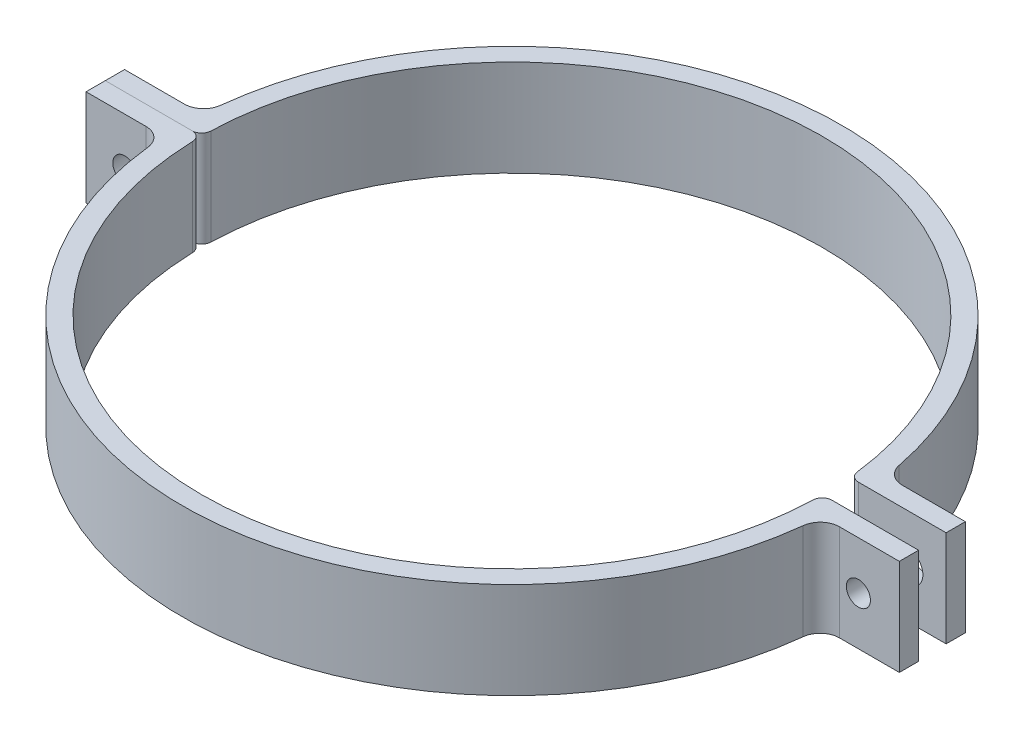
ISO-10303-21;
HEADER;
FILE_DESCRIPTION(('STEP AP214'),'2;1');
FILE_NAME('part.step','',(''),(''),'','','');
FILE_SCHEMA(('AUTOMOTIVE_DESIGN { 1 0 10303 214 1 1 1 1 }'));
ENDSEC;
DATA;
#1=APPLICATION_CONTEXT('core data for automotive mechanical design processes');
#2=APPLICATION_PROTOCOL_DEFINITION('international standard','automotive_design',2000,#1);
#3=PRODUCT_CONTEXT('',#1,'mechanical');
#4=PRODUCT('Part','Part','',(#3));
#5=PRODUCT_RELATED_PRODUCT_CATEGORY('part','',(#4));
#6=PRODUCT_DEFINITION_FORMATION('','',#4);
#7=PRODUCT_DEFINITION_CONTEXT('part definition',#1,'design');
#8=PRODUCT_DEFINITION('design','',#6,#7);
#9=PRODUCT_DEFINITION_SHAPE('','',#8);
#10=(LENGTH_UNIT() NAMED_UNIT(*) SI_UNIT(.MILLI.,.METRE.));
#11=(NAMED_UNIT(*) PLANE_ANGLE_UNIT() SI_UNIT($,.RADIAN.));
#12=(NAMED_UNIT(*) SI_UNIT($,.STERADIAN.) SOLID_ANGLE_UNIT());
#13=UNCERTAINTY_MEASURE_WITH_UNIT(LENGTH_MEASURE(1.E-05),#10,'distance_accuracy_value','');
#14=(GEOMETRIC_REPRESENTATION_CONTEXT(3) GLOBAL_UNCERTAINTY_ASSIGNED_CONTEXT((#13)) GLOBAL_UNIT_ASSIGNED_CONTEXT((#10,
#11,#12)) REPRESENTATION_CONTEXT('',''));
#15=CARTESIAN_POINT('',(0.,0.,0.));
#16=DIRECTION('',(0.,0.,1.));
#17=DIRECTION('',(1.,0.,0.));
#18=AXIS2_PLACEMENT_3D('',#15,#16,#17);
#19=CARTESIAN_POINT('',(0.,10.,0.));
#20=DIRECTION('',(0.,-1.,0.));
#21=DIRECTION('',(0.,0.,-1.));
#22=AXIS2_PLACEMENT_3D('',#19,#20,#21);
#23=CYLINDRICAL_SURFACE('',#22,34.25);
#24=CARTESIAN_POINT('',(0.,0.,0.));
#25=DIRECTION('',(0.,1.,0.));
#26=DIRECTION('',(0.,0.,1.));
#27=AXIS2_PLACEMENT_3D('',#24,#25,#26);
#28=CIRCLE('',#27,34.25);
#29=CARTESIAN_POINT('',(33.6053602983926,0.,-6.61379310344828));
#30=VERTEX_POINT('',#29);
#31=CARTESIAN_POINT('',(-34.0408477173745,0.,-3.77931034482759));
#32=VERTEX_POINT('',#31);
#33=EDGE_CURVE('E201',#30,#32,#28,.T.);
#34=ORIENTED_EDGE('',*,*,#33,.T.);
#35=DIRECTION('',(0.,-1.,0.));
#36=VECTOR('',#35,1.);
#37=CARTESIAN_POINT('',(-34.0408477173745,10.,-3.77931034482759));
#38=LINE('',#37,#36);
#39=CARTESIAN_POINT('',(-34.0408477173745,10.,-3.77931034482759));
#40=VERTEX_POINT('',#39);
#41=EDGE_CURVE('E222',#32,#40,#38,.F.);
#42=ORIENTED_EDGE('',*,*,#41,.T.);
#43=CARTESIAN_POINT('',(0.,10.,0.));
#44=DIRECTION('',(0.,1.,0.));
#45=DIRECTION('',(0.,0.,1.));
#46=AXIS2_PLACEMENT_3D('',#43,#44,#45);
#47=CIRCLE('',#46,34.25);
#48=CARTESIAN_POINT('',(33.6053602983926,10.,-6.61379310344828));
#49=VERTEX_POINT('',#48);
#50=EDGE_CURVE('E198',#49,#40,#47,.T.);
#51=ORIENTED_EDGE('',*,*,#50,.F.);
#52=DIRECTION('',(0.,-1.,0.));
#53=VECTOR('',#52,1.);
#54=CARTESIAN_POINT('',(33.6053602983926,10.,-6.61379310344828));
#55=LINE('',#54,#53);
#56=EDGE_CURVE('E219',#49,#30,#55,.T.);
#57=ORIENTED_EDGE('',*,*,#56,.T.);
#58=EDGE_LOOP('',(#34,#42,#51,#57));
#59=FACE_BOUND('',#58,.T.);
#60=ADVANCED_FACE('F50',(#59),#23,.T.);
#61=CARTESIAN_POINT('',(0.,0.,0.));
#62=DIRECTION('',(0.,0.,1.));
#63=DIRECTION('',(1.,0.,0.));
#64=AXIS2_PLACEMENT_3D('',#61,#62,#63);
#65=PLANE('',#64);
#66=CARTESIAN_POINT('',(-38.2207779875617,5.,0.));
#67=DIRECTION('',(0.,0.,1.));
#68=DIRECTION('',(1.,0.,0.));
#69=AXIS2_PLACEMENT_3D('',#66,#67,#68);
#70=CIRCLE('',#69,1.69999999999999);
#71=CARTESIAN_POINT('',(-36.5207779875617,5.,0.));
#72=VERTEX_POINT('',#71);
#73=EDGE_CURVE('E211',#72,#72,#70,.T.);
#74=ORIENTED_EDGE('',*,*,#73,.F.);
#75=EDGE_LOOP('',(#74));
#76=FACE_BOUND('',#75,.T.);
#77=DIRECTION('',(1.,0.,0.));
#78=VECTOR('',#77,1.);
#79=CARTESIAN_POINT('',(0.,0.,0.));
#80=LINE('',#79,#78);
#81=CARTESIAN_POINT('',(-42.25,0.,0.));
#82=VERTEX_POINT('',#81);
#83=CARTESIAN_POINT('',(-33.2349590040367,0.,0.));
#84=VERTEX_POINT('',#83);
#85=EDGE_CURVE('E194',#82,#84,#80,.T.);
#86=ORIENTED_EDGE('',*,*,#85,.T.);
#87=DIRECTION('',(0.,-1.,0.));
#88=VECTOR('',#87,1.);
#89=CARTESIAN_POINT('',(-33.2349590040367,0.,0.));
#90=LINE('',#89,#88);
#91=CARTESIAN_POINT('',(-33.2349590040367,10.,0.));
#92=VERTEX_POINT('',#91);
#93=EDGE_CURVE('E73',#84,#92,#90,.F.);
#94=ORIENTED_EDGE('',*,*,#93,.T.);
#95=DIRECTION('',(1.,0.,0.));
#96=VECTOR('',#95,1.);
#97=CARTESIAN_POINT('',(0.,10.,0.));
#98=LINE('',#97,#96);
#99=CARTESIAN_POINT('',(-42.25,10.,0.));
#100=VERTEX_POINT('',#99);
#101=EDGE_CURVE('E196',#100,#92,#98,.T.);
#102=ORIENTED_EDGE('',*,*,#101,.F.);
#103=DIRECTION('',(0.,-1.,0.));
#104=VECTOR('',#103,1.);
#105=CARTESIAN_POINT('',(-42.25,0.,0.));
#106=LINE('',#105,#104);
#107=EDGE_CURVE('E153',#100,#82,#106,.T.);
#108=ORIENTED_EDGE('',*,*,#107,.T.);
#109=EDGE_LOOP('',(#86,#94,#102,#108));
#110=FACE_BOUND('',#109,.T.);
#111=ADVANCED_FACE('F253',(#76,#110),#65,.T.);
#112=CARTESIAN_POINT('',(0.,0.,0.));
#113=DIRECTION('',(0.,1.,0.));
#114=DIRECTION('',(0.,0.,1.));
#115=AXIS2_PLACEMENT_3D('',#112,#113,#114);
#116=PLANE('',#115);
#117=CARTESIAN_POINT('',(0.,0.,0.));
#118=DIRECTION('',(0.,1.,0.));
#119=DIRECTION('',(0.,0.,1.));
#120=AXIS2_PLACEMENT_3D('',#117,#118,#119);
#121=CIRCLE('',#120,32.25);
#122=CARTESIAN_POINT('',(32.0157841344568,0.,-3.8796992481203));
#123=VERTEX_POINT('',#122);
#124=CARTESIAN_POINT('',(-32.2354113648176,0.,-0.969924812030075));
#125=VERTEX_POINT('',#124);
#126=EDGE_CURVE('E207',#123,#125,#121,.T.);
#127=ORIENTED_EDGE('',*,*,#126,.T.);
#128=CARTESIAN_POINT('',(-33.2349590040367,0.,-1.));
#129=DIRECTION('',(0.,1.,0.));
#130=DIRECTION('',(0.,0.,1.));
#131=AXIS2_PLACEMENT_3D('',#128,#129,#130);
#132=CIRCLE('',#131,1.);
#133=EDGE_CURVE('E240',#125,#84,#132,.F.);
#134=ORIENTED_EDGE('',*,*,#133,.T.);
#135=ORIENTED_EDGE('',*,*,#85,.F.);
#136=DIRECTION('',(0.,0.,1.));
#137=VECTOR('',#136,1.);
#138=CARTESIAN_POINT('',(-42.25,0.,-2.));
#139=LINE('',#138,#137);
#140=CARTESIAN_POINT('',(-42.25,0.,-2.));
#141=VERTEX_POINT('',#140);
#142=EDGE_CURVE('E161',#141,#82,#139,.T.);
#143=ORIENTED_EDGE('',*,*,#142,.F.);
#144=DIRECTION('',(1.,0.,0.));
#145=VECTOR('',#144,1.);
#146=CARTESIAN_POINT('',(-32.25,0.,-2.));
#147=LINE('',#146,#145);
#148=CARTESIAN_POINT('',(-36.0286344453963,0.,-2.));
#149=VERTEX_POINT('',#148);
#150=EDGE_CURVE('E162',#141,#149,#147,.T.);
#151=ORIENTED_EDGE('',*,*,#150,.T.);
#152=CARTESIAN_POINT('',(-36.0286344453963,0.,-4.));
#153=DIRECTION('',(0.,1.,0.));
#154=DIRECTION('',(0.,0.,1.));
#155=AXIS2_PLACEMENT_3D('',#152,#153,#154);
#156=CIRCLE('',#155,2.);
#157=EDGE_CURVE('E226',#149,#32,#156,.T.);
#158=ORIENTED_EDGE('',*,*,#157,.T.);
#159=ORIENTED_EDGE('',*,*,#33,.F.);
#160=CARTESIAN_POINT('',(35.5677171041381,0.,-7.));
#161=DIRECTION('',(0.,1.,0.));
#162=DIRECTION('',(0.,0.,1.));
#163=AXIS2_PLACEMENT_3D('',#160,#161,#162);
#164=CIRCLE('',#163,2.);
#165=CARTESIAN_POINT('',(35.5677171041381,0.,-5.));
#166=VERTEX_POINT('',#165);
#167=EDGE_CURVE('E229',#30,#166,#164,.T.);
#168=ORIENTED_EDGE('',*,*,#167,.T.);
#169=DIRECTION('',(1.,0.,0.));
#170=VECTOR('',#169,1.);
#171=CARTESIAN_POINT('',(32.1101619429115,0.,-5.));
#172=LINE('',#171,#170);
#173=CARTESIAN_POINT('',(42.1101619429115,0.,-5.));
#174=VERTEX_POINT('',#173);
#175=EDGE_CURVE('E174',#166,#174,#172,.T.);
#176=ORIENTED_EDGE('',*,*,#175,.T.);
#177=DIRECTION('',(0.,0.,1.));
#178=VECTOR('',#177,1.);
#179=CARTESIAN_POINT('',(42.1101619429115,0.,-5.));
#180=LINE('',#179,#178);
#181=CARTESIAN_POINT('',(42.1101619429115,0.,-3.));
#182=VERTEX_POINT('',#181);
#183=EDGE_CURVE('E182',#174,#182,#180,.T.);
#184=ORIENTED_EDGE('',*,*,#183,.T.);
#185=DIRECTION('',(-1.,0.,0.));
#186=VECTOR('',#185,1.);
#187=CARTESIAN_POINT('',(27.7467052715466,0.,-3.));
#188=LINE('',#187,#186);
#189=CARTESIAN_POINT('',(33.0085216269981,0.,-3.));
#190=VERTEX_POINT('',#189);
#191=EDGE_CURVE('E191',#182,#190,#188,.T.);
#192=ORIENTED_EDGE('',*,*,#191,.T.);
#193=CARTESIAN_POINT('',(33.0085216269981,0.,-4.));
#194=DIRECTION('',(0.,1.,0.));
#195=DIRECTION('',(0.,0.,1.));
#196=AXIS2_PLACEMENT_3D('',#193,#194,#195);
#197=CIRCLE('',#196,1.);
#198=EDGE_CURVE('E238',#190,#123,#197,.F.);
#199=ORIENTED_EDGE('',*,*,#198,.T.);
#200=EDGE_LOOP('',(#127,#134,#135,#143,#151,#158,#159,#168,#176,#184,#192,#199));
#201=FACE_BOUND('',#200,.T.);
#202=ADVANCED_FACE('F252',(#201),#116,.F.);
#203=CARTESIAN_POINT('',(0.,10.,0.));
#204=DIRECTION('',(0.,1.,0.));
#205=DIRECTION('',(0.,0.,1.));
#206=AXIS2_PLACEMENT_3D('',#203,#204,#205);
#207=PLANE('',#206);
#208=ORIENTED_EDGE('',*,*,#101,.T.);
#209=CARTESIAN_POINT('',(-33.2349590040367,10.,-1.));
#210=DIRECTION('',(0.,1.,0.));
#211=DIRECTION('',(0.,0.,1.));
#212=AXIS2_PLACEMENT_3D('',#209,#210,#211);
#213=CIRCLE('',#212,1.);
#214=CARTESIAN_POINT('',(-32.2354113648176,10.,-0.969924812030075));
#215=VERTEX_POINT('',#214);
#216=EDGE_CURVE('E58',#92,#215,#213,.T.);
#217=ORIENTED_EDGE('',*,*,#216,.T.);
#218=CARTESIAN_POINT('',(0.,10.,0.));
#219=DIRECTION('',(0.,1.,0.));
#220=DIRECTION('',(0.,0.,1.));
#221=AXIS2_PLACEMENT_3D('',#218,#219,#220);
#222=CIRCLE('',#221,32.25);
#223=CARTESIAN_POINT('',(32.0157841344568,10.,-3.8796992481203));
#224=VERTEX_POINT('',#223);
#225=EDGE_CURVE('E204',#224,#215,#222,.T.);
#226=ORIENTED_EDGE('',*,*,#225,.F.);
#227=CARTESIAN_POINT('',(33.0085216269981,10.,-4.));
#228=DIRECTION('',(0.,1.,0.));
#229=DIRECTION('',(0.,0.,1.));
#230=AXIS2_PLACEMENT_3D('',#227,#228,#229);
#231=CIRCLE('',#230,1.);
#232=CARTESIAN_POINT('',(33.0085216269981,10.,-3.));
#233=VERTEX_POINT('',#232);
#234=EDGE_CURVE('E65',#224,#233,#231,.T.);
#235=ORIENTED_EDGE('',*,*,#234,.T.);
#236=DIRECTION('',(-1.,0.,0.));
#237=VECTOR('',#236,1.);
#238=CARTESIAN_POINT('',(27.7467052715466,10.,-3.));
#239=LINE('',#238,#237);
#240=CARTESIAN_POINT('',(42.1101619429115,10.,-3.));
#241=VERTEX_POINT('',#240);
#242=EDGE_CURVE('E188',#241,#233,#239,.T.);
#243=ORIENTED_EDGE('',*,*,#242,.F.);
#244=DIRECTION('',(0.,0.,1.));
#245=VECTOR('',#244,1.);
#246=CARTESIAN_POINT('',(42.1101619429115,10.,-5.));
#247=LINE('',#246,#245);
#248=CARTESIAN_POINT('',(42.1101619429115,10.,-5.));
#249=VERTEX_POINT('',#248);
#250=EDGE_CURVE('E185',#249,#241,#247,.T.);
#251=ORIENTED_EDGE('',*,*,#250,.F.);
#252=DIRECTION('',(-1.,0.,0.));
#253=VECTOR('',#252,1.);
#254=CARTESIAN_POINT('',(32.1101619429115,10.,-5.));
#255=LINE('',#254,#253);
#256=CARTESIAN_POINT('',(35.5677171041381,10.,-5.));
#257=VERTEX_POINT('',#256);
#258=EDGE_CURVE('E179',#249,#257,#255,.T.);
#259=ORIENTED_EDGE('',*,*,#258,.T.);
#260=CARTESIAN_POINT('',(35.5677171041381,10.,-7.));
#261=DIRECTION('',(0.,1.,0.));
#262=DIRECTION('',(0.,0.,1.));
#263=AXIS2_PLACEMENT_3D('',#260,#261,#262);
#264=CIRCLE('',#263,2.);
#265=EDGE_CURVE('E231',#257,#49,#264,.F.);
#266=ORIENTED_EDGE('',*,*,#265,.T.);
#267=ORIENTED_EDGE('',*,*,#50,.T.);
#268=CARTESIAN_POINT('',(-36.0286344453963,10.,-4.));
#269=DIRECTION('',(0.,1.,0.));
#270=DIRECTION('',(0.,0.,1.));
#271=AXIS2_PLACEMENT_3D('',#268,#269,#270);
#272=CIRCLE('',#271,2.);
#273=CARTESIAN_POINT('',(-36.0286344453963,10.,-2.));
#274=VERTEX_POINT('',#273);
#275=EDGE_CURVE('E147',#40,#274,#272,.F.);
#276=ORIENTED_EDGE('',*,*,#275,.T.);
#277=DIRECTION('',(-1.,0.,0.));
#278=VECTOR('',#277,1.);
#279=CARTESIAN_POINT('',(-32.25,10.,-2.));
#280=LINE('',#279,#278);
#281=CARTESIAN_POINT('',(-42.25,10.,-2.));
#282=VERTEX_POINT('',#281);
#283=EDGE_CURVE('E140',#274,#282,#280,.T.);
#284=ORIENTED_EDGE('',*,*,#283,.T.);
#285=DIRECTION('',(0.,0.,1.));
#286=VECTOR('',#285,1.);
#287=CARTESIAN_POINT('',(-42.25,10.,-2.));
#288=LINE('',#287,#286);
#289=EDGE_CURVE('E143',#282,#100,#288,.T.);
#290=ORIENTED_EDGE('',*,*,#289,.T.);
#291=EDGE_LOOP('',(#208,#217,#226,#235,#243,#251,#259,#266,#267,#276,#284,#290));
#292=FACE_BOUND('',#291,.T.);
#293=ADVANCED_FACE('F142',(#292),#207,.T.);
#294=CARTESIAN_POINT('',(0.,10.,0.));
#295=DIRECTION('',(0.,-1.,0.));
#296=DIRECTION('',(0.,0.,-1.));
#297=AXIS2_PLACEMENT_3D('',#294,#295,#296);
#298=CYLINDRICAL_SURFACE('',#297,32.25);
#299=ORIENTED_EDGE('',*,*,#225,.T.);
#300=DIRECTION('',(0.,-1.,0.));
#301=VECTOR('',#300,1.);
#302=CARTESIAN_POINT('',(-32.2354113648176,10.,-0.969924812030075));
#303=LINE('',#302,#301);
#304=EDGE_CURVE('E235',#215,#125,#303,.T.);
#305=ORIENTED_EDGE('',*,*,#304,.T.);
#306=ORIENTED_EDGE('',*,*,#126,.F.);
#307=DIRECTION('',(0.,-1.,0.));
#308=VECTOR('',#307,1.);
#309=CARTESIAN_POINT('',(32.0157841344568,10.,-3.8796992481203));
#310=LINE('',#309,#308);
#311=EDGE_CURVE('E233',#123,#224,#310,.F.);
#312=ORIENTED_EDGE('',*,*,#311,.T.);
#313=EDGE_LOOP('',(#299,#305,#306,#312));
#314=FACE_BOUND('',#313,.T.);
#315=ADVANCED_FACE('F247',(#314),#298,.F.);
#316=CARTESIAN_POINT('',(27.7467052715466,0.,-3.));
#317=DIRECTION('',(0.,0.,-1.));
#318=DIRECTION('',(-1.,0.,0.));
#319=AXIS2_PLACEMENT_3D('',#316,#317,#318);
#320=PLANE('',#319);
#321=CARTESIAN_POINT('',(37.9966164685705,5.,-3.));
#322=DIRECTION('',(0.,0.,-1.));
#323=DIRECTION('',(-1.,0.,0.));
#324=AXIS2_PLACEMENT_3D('',#321,#322,#323);
#325=CIRCLE('',#324,1.69999999999999);
#326=CARTESIAN_POINT('',(36.2966164685705,5.,-3.));
#327=VERTEX_POINT('',#326);
#328=EDGE_CURVE('E214',#327,#327,#325,.T.);
#329=ORIENTED_EDGE('',*,*,#328,.T.);
#330=EDGE_LOOP('',(#329));
#331=FACE_BOUND('',#330,.T.);
#332=ORIENTED_EDGE('',*,*,#242,.T.);
#333=DIRECTION('',(0.,1.,0.));
#334=VECTOR('',#333,1.);
#335=CARTESIAN_POINT('',(33.0085216269981,0.,-3.));
#336=LINE('',#335,#334);
#337=EDGE_CURVE('E13',#233,#190,#336,.F.);
#338=ORIENTED_EDGE('',*,*,#337,.T.);
#339=ORIENTED_EDGE('',*,*,#191,.F.);
#340=DIRECTION('',(0.,1.,0.));
#341=VECTOR('',#340,1.);
#342=CARTESIAN_POINT('',(42.1101619429115,0.,-3.));
#343=LINE('',#342,#341);
#344=EDGE_CURVE('E172',#182,#241,#343,.T.);
#345=ORIENTED_EDGE('',*,*,#344,.T.);
#346=EDGE_LOOP('',(#332,#338,#339,#345));
#347=FACE_BOUND('',#346,.T.);
#348=ADVANCED_FACE('F257',(#331,#347),#320,.F.);
#349=CARTESIAN_POINT('',(0.,0.,-5.));
#350=DIRECTION('',(0.,0.,-1.));
#351=DIRECTION('',(-1.,0.,0.));
#352=AXIS2_PLACEMENT_3D('',#349,#350,#351);
#353=PLANE('',#352);
#354=CARTESIAN_POINT('',(37.9966164685705,5.,-5.));
#355=DIRECTION('',(0.,0.,-1.));
#356=DIRECTION('',(-1.,0.,0.));
#357=AXIS2_PLACEMENT_3D('',#354,#355,#356);
#358=CIRCLE('',#357,1.69999999999999);
#359=CARTESIAN_POINT('',(36.2966164685705,5.,-5.));
#360=VERTEX_POINT('',#359);
#361=EDGE_CURVE('E217',#360,#360,#358,.T.);
#362=ORIENTED_EDGE('',*,*,#361,.F.);
#363=EDGE_LOOP('',(#362));
#364=FACE_BOUND('',#363,.T.);
#365=ORIENTED_EDGE('',*,*,#175,.F.);
#366=DIRECTION('',(0.,-1.,0.));
#367=VECTOR('',#366,1.);
#368=CARTESIAN_POINT('',(35.5677171041381,0.,-5.));
#369=LINE('',#368,#367);
#370=EDGE_CURVE('E224',#166,#257,#369,.F.);
#371=ORIENTED_EDGE('',*,*,#370,.T.);
#372=ORIENTED_EDGE('',*,*,#258,.F.);
#373=DIRECTION('',(0.,1.,0.));
#374=VECTOR('',#373,1.);
#375=CARTESIAN_POINT('',(42.1101619429115,0.,-5.));
#376=LINE('',#375,#374);
#377=EDGE_CURVE('E176',#174,#249,#376,.T.);
#378=ORIENTED_EDGE('',*,*,#377,.F.);
#379=EDGE_LOOP('',(#365,#371,#372,#378));
#380=FACE_BOUND('',#379,.T.);
#381=ADVANCED_FACE('F269',(#364,#380),#353,.T.);
#382=CARTESIAN_POINT('',(42.1101619429115,0.,-5.));
#383=DIRECTION('',(1.,0.,0.));
#384=DIRECTION('',(0.,0.,-1.));
#385=AXIS2_PLACEMENT_3D('',#382,#383,#384);
#386=PLANE('',#385);
#387=ORIENTED_EDGE('',*,*,#344,.F.);
#388=ORIENTED_EDGE('',*,*,#183,.F.);
#389=ORIENTED_EDGE('',*,*,#377,.T.);
#390=ORIENTED_EDGE('',*,*,#250,.T.);
#391=EDGE_LOOP('',(#387,#388,#389,#390));
#392=FACE_BOUND('',#391,.T.);
#393=ADVANCED_FACE('F299',(#392),#386,.T.);
#394=CARTESIAN_POINT('',(0.,0.,-2.));
#395=DIRECTION('',(0.,0.,1.));
#396=DIRECTION('',(1.,0.,0.));
#397=AXIS2_PLACEMENT_3D('',#394,#395,#396);
#398=PLANE('',#397);
#399=CARTESIAN_POINT('',(-38.2207779875617,5.,-2.));
#400=DIRECTION('',(0.,0.,1.));
#401=DIRECTION('',(1.,0.,0.));
#402=AXIS2_PLACEMENT_3D('',#399,#400,#401);
#403=CIRCLE('',#402,1.69999999999999);
#404=CARTESIAN_POINT('',(-36.5207779875617,5.,-2.));
#405=VERTEX_POINT('',#404);
#406=EDGE_CURVE('E171',#405,#405,#403,.T.);
#407=ORIENTED_EDGE('',*,*,#406,.T.);
#408=EDGE_LOOP('',(#407));
#409=FACE_BOUND('',#408,.T.);
#410=ORIENTED_EDGE('',*,*,#283,.F.);
#411=DIRECTION('',(0.,1.,0.));
#412=VECTOR('',#411,1.);
#413=CARTESIAN_POINT('',(-36.0286344453963,0.,-2.));
#414=LINE('',#413,#412);
#415=EDGE_CURVE('E210',#274,#149,#414,.F.);
#416=ORIENTED_EDGE('',*,*,#415,.T.);
#417=ORIENTED_EDGE('',*,*,#150,.F.);
#418=DIRECTION('',(0.,-1.,0.));
#419=VECTOR('',#418,1.);
#420=CARTESIAN_POINT('',(-42.25,0.,-2.));
#421=LINE('',#420,#419);
#422=EDGE_CURVE('E152',#282,#141,#421,.T.);
#423=ORIENTED_EDGE('',*,*,#422,.F.);
#424=EDGE_LOOP('',(#410,#416,#417,#423));
#425=FACE_BOUND('',#424,.T.);
#426=ADVANCED_FACE('F164',(#409,#425),#398,.F.);
#427=CARTESIAN_POINT('',(-42.25,0.,-2.));
#428=DIRECTION('',(-1.,0.,0.));
#429=DIRECTION('',(0.,0.,1.));
#430=AXIS2_PLACEMENT_3D('',#427,#428,#429);
#431=PLANE('',#430);
#432=ORIENTED_EDGE('',*,*,#107,.F.);
#433=ORIENTED_EDGE('',*,*,#289,.F.);
#434=ORIENTED_EDGE('',*,*,#422,.T.);
#435=ORIENTED_EDGE('',*,*,#142,.T.);
#436=EDGE_LOOP('',(#432,#433,#434,#435));
#437=FACE_BOUND('',#436,.T.);
#438=ADVANCED_FACE('F157',(#437),#431,.T.);
#439=CARTESIAN_POINT('',(-38.2207779875617,5.,-5.));
#440=DIRECTION('',(0.,0.,-1.));
#441=DIRECTION('',(-1.,0.,0.));
#442=AXIS2_PLACEMENT_3D('',#439,#440,#441);
#443=CYLINDRICAL_SURFACE('',#442,1.69999999999999);
#444=ORIENTED_EDGE('',*,*,#73,.T.);
#445=EDGE_LOOP('',(#444));
#446=FACE_BOUND('',#445,.T.);
#447=ORIENTED_EDGE('',*,*,#406,.F.);
#448=EDGE_LOOP('',(#447));
#449=FACE_BOUND('',#448,.T.);
#450=ADVANCED_FACE('F319',(#446,#449),#443,.F.);
#451=CARTESIAN_POINT('',(37.9966164685705,5.,-5.));
#452=DIRECTION('',(0.,0.,-1.));
#453=DIRECTION('',(-1.,0.,0.));
#454=AXIS2_PLACEMENT_3D('',#451,#452,#453);
#455=CYLINDRICAL_SURFACE('',#454,1.69999999999999);
#456=ORIENTED_EDGE('',*,*,#361,.T.);
#457=EDGE_LOOP('',(#456));
#458=FACE_BOUND('',#457,.T.);
#459=ORIENTED_EDGE('',*,*,#328,.F.);
#460=EDGE_LOOP('',(#459));
#461=FACE_BOUND('',#460,.T.);
#462=ADVANCED_FACE('F281',(#458,#461),#455,.F.);
#463=CARTESIAN_POINT('',(-36.0286344453963,10.,-4.));
#464=DIRECTION('',(0.,-1.,0.));
#465=DIRECTION('',(0.,0.,-1.));
#466=AXIS2_PLACEMENT_3D('',#463,#464,#465);
#467=CYLINDRICAL_SURFACE('',#466,2.);
#468=ORIENTED_EDGE('',*,*,#275,.F.);
#469=ORIENTED_EDGE('',*,*,#41,.F.);
#470=ORIENTED_EDGE('',*,*,#157,.F.);
#471=ORIENTED_EDGE('',*,*,#415,.F.);
#472=EDGE_LOOP('',(#468,#469,#470,#471));
#473=FACE_BOUND('',#472,.T.);
#474=ADVANCED_FACE('F277',(#473),#467,.F.);
#475=CARTESIAN_POINT('',(35.5677171041381,10.,-7.));
#476=DIRECTION('',(0.,-1.,0.));
#477=DIRECTION('',(0.,0.,-1.));
#478=AXIS2_PLACEMENT_3D('',#475,#476,#477);
#479=CYLINDRICAL_SURFACE('',#478,2.);
#480=ORIENTED_EDGE('',*,*,#265,.F.);
#481=ORIENTED_EDGE('',*,*,#370,.F.);
#482=ORIENTED_EDGE('',*,*,#167,.F.);
#483=ORIENTED_EDGE('',*,*,#56,.F.);
#484=EDGE_LOOP('',(#480,#481,#482,#483));
#485=FACE_BOUND('',#484,.T.);
#486=ADVANCED_FACE('F280',(#485),#479,.F.);
#487=CARTESIAN_POINT('',(-33.2349590040367,10.,-1.));
#488=DIRECTION('',(0.,-1.,0.));
#489=DIRECTION('',(0.,0.,-1.));
#490=AXIS2_PLACEMENT_3D('',#487,#488,#489);
#491=CYLINDRICAL_SURFACE('',#490,1.);
#492=ORIENTED_EDGE('',*,*,#216,.F.);
#493=ORIENTED_EDGE('',*,*,#93,.F.);
#494=ORIENTED_EDGE('',*,*,#133,.F.);
#495=ORIENTED_EDGE('',*,*,#304,.F.);
#496=EDGE_LOOP('',(#492,#493,#494,#495));
#497=FACE_BOUND('',#496,.T.);
#498=ADVANCED_FACE('F250',(#497),#491,.T.);
#499=CARTESIAN_POINT('',(33.0085216269981,10.,-4.));
#500=DIRECTION('',(0.,-1.,0.));
#501=DIRECTION('',(0.,0.,-1.));
#502=AXIS2_PLACEMENT_3D('',#499,#500,#501);
#503=CYLINDRICAL_SURFACE('',#502,1.);
#504=ORIENTED_EDGE('',*,*,#234,.F.);
#505=ORIENTED_EDGE('',*,*,#311,.F.);
#506=ORIENTED_EDGE('',*,*,#198,.F.);
#507=ORIENTED_EDGE('',*,*,#337,.F.);
#508=EDGE_LOOP('',(#504,#505,#506,#507));
#509=FACE_BOUND('',#508,.T.);
#510=ADVANCED_FACE('F52',(#509),#503,.T.);
#511=CLOSED_SHELL('',(#60,#111,#202,#293,#315,#348,#381,#393,#426,#438,#450,#462,#474,#486,#498,#510));
#512=MANIFOLD_SOLID_BREP('B2',#511);
#513=CARTESIAN_POINT('',(0.,10.,0.));
#514=DIRECTION('',(0.,-1.,0.));
#515=DIRECTION('',(0.,0.,-1.));
#516=AXIS2_PLACEMENT_3D('',#513,#514,#515);
#517=CYLINDRICAL_SURFACE('',#516,34.25);
#518=CARTESIAN_POINT('',(0.,10.,0.));
#519=DIRECTION('',(0.,1.,0.));
#520=DIRECTION('',(0.,0.,1.));
#521=AXIS2_PLACEMENT_3D('',#518,#519,#520);
#522=CIRCLE('',#521,34.25);
#523=CARTESIAN_POINT('',(-34.0408477173745,10.,3.77931034482759));
#524=VERTEX_POINT('',#523);
#525=CARTESIAN_POINT('',(34.0408477173745,10.,3.77931034482759));
#526=VERTEX_POINT('',#525);
#527=EDGE_CURVE('E581',#524,#526,#522,.T.);
#528=ORIENTED_EDGE('',*,*,#527,.F.);
#529=DIRECTION('',(0.,-1.,0.));
#530=VECTOR('',#529,1.);
#531=CARTESIAN_POINT('',(-34.0408477173745,10.,3.77931034482759));
#532=LINE('',#531,#530);
#533=CARTESIAN_POINT('',(-34.0408477173745,0.,3.77931034482759));
#534=VERTEX_POINT('',#533);
#535=EDGE_CURVE('E619',#524,#534,#532,.T.);
#536=ORIENTED_EDGE('',*,*,#535,.T.);
#537=CARTESIAN_POINT('',(0.,0.,0.));
#538=DIRECTION('',(0.,1.,0.));
#539=DIRECTION('',(0.,0.,1.));
#540=AXIS2_PLACEMENT_3D('',#537,#538,#539);
#541=CIRCLE('',#540,34.25);
#542=CARTESIAN_POINT('',(34.0408477173745,0.,3.77931034482759));
#543=VERTEX_POINT('',#542);
#544=EDGE_CURVE('E578',#534,#543,#541,.T.);
#545=ORIENTED_EDGE('',*,*,#544,.T.);
#546=DIRECTION('',(0.,-1.,0.));
#547=VECTOR('',#546,1.);
#548=CARTESIAN_POINT('',(34.0408477173745,10.,3.77931034482759));
#549=LINE('',#548,#547);
#550=EDGE_CURVE('E617',#543,#526,#549,.F.);
#551=ORIENTED_EDGE('',*,*,#550,.T.);
#552=EDGE_LOOP('',(#528,#536,#545,#551));
#553=FACE_BOUND('',#552,.T.);
#554=ADVANCED_FACE('F442',(#553),#517,.T.);
#555=CARTESIAN_POINT('',(0.,0.,0.));
#556=DIRECTION('',(0.,0.,1.));
#557=DIRECTION('',(1.,0.,0.));
#558=AXIS2_PLACEMENT_3D('',#555,#556,#557);
#559=PLANE('',#558);
#560=CARTESIAN_POINT('',(-38.2207779875617,5.,0.));
#561=DIRECTION('',(0.,0.,1.));
#562=DIRECTION('',(1.,0.,0.));
#563=AXIS2_PLACEMENT_3D('',#560,#561,#562);
#564=CIRCLE('',#563,1.25);
#565=CARTESIAN_POINT('',(-36.9707779875617,5.,0.));
#566=VERTEX_POINT('',#565);
#567=EDGE_CURVE('E555',#566,#566,#564,.T.);
#568=ORIENTED_EDGE('',*,*,#567,.T.);
#569=EDGE_LOOP('',(#568));
#570=FACE_BOUND('',#569,.T.);
#571=DIRECTION('',(1.,0.,0.));
#572=VECTOR('',#571,1.);
#573=CARTESIAN_POINT('',(0.,10.,0.));
#574=LINE('',#573,#572);
#575=CARTESIAN_POINT('',(-42.25,10.,0.));
#576=VERTEX_POINT('',#575);
#577=CARTESIAN_POINT('',(-33.2349590040367,10.,0.));
#578=VERTEX_POINT('',#577);
#579=EDGE_CURVE('E589',#576,#578,#574,.T.);
#580=ORIENTED_EDGE('',*,*,#579,.T.);
#581=DIRECTION('',(0.,1.,0.));
#582=VECTOR('',#581,1.);
#583=CARTESIAN_POINT('',(-33.2349590040367,0.,0.));
#584=LINE('',#583,#582);
#585=CARTESIAN_POINT('',(-33.2349590040367,0.,0.));
#586=VERTEX_POINT('',#585);
#587=EDGE_CURVE('E614',#578,#586,#584,.F.);
#588=ORIENTED_EDGE('',*,*,#587,.T.);
#589=DIRECTION('',(1.,0.,0.));
#590=VECTOR('',#589,1.);
#591=CARTESIAN_POINT('',(0.,0.,0.));
#592=LINE('',#591,#590);
#593=CARTESIAN_POINT('',(-42.25,0.,0.));
#594=VERTEX_POINT('',#593);
#595=EDGE_CURVE('E586',#594,#586,#592,.T.);
#596=ORIENTED_EDGE('',*,*,#595,.F.);
#597=DIRECTION('',(0.,1.,0.));
#598=VECTOR('',#597,1.);
#599=CARTESIAN_POINT('',(-42.25,0.,0.));
#600=LINE('',#599,#598);
#601=EDGE_CURVE('E556',#594,#576,#600,.T.);
#602=ORIENTED_EDGE('',*,*,#601,.T.);
#603=EDGE_LOOP('',(#580,#588,#596,#602));
#604=FACE_BOUND('',#603,.T.);
#605=ADVANCED_FACE('F643',(#570,#604),#559,.F.);
#606=CARTESIAN_POINT('',(37.9966164685705,5.,0.));
#607=DIRECTION('',(0.,0.,1.));
#608=DIRECTION('',(1.,0.,0.));
#609=AXIS2_PLACEMENT_3D('',#606,#607,#608);
#610=CIRCLE('',#609,1.25);
#611=CARTESIAN_POINT('',(39.2466164685705,5.,0.));
#612=VERTEX_POINT('',#611);
#613=EDGE_CURVE('E596',#612,#612,#610,.T.);
#614=ORIENTED_EDGE('',*,*,#613,.T.);
#615=EDGE_LOOP('',(#614));
#616=FACE_BOUND('',#615,.T.);
#617=CARTESIAN_POINT('',(33.2349590040367,0.,0.));
#618=VERTEX_POINT('',#617);
#619=CARTESIAN_POINT('',(42.25,0.,0.));
#620=VERTEX_POINT('',#619);
#621=EDGE_CURVE('E583',#618,#620,#592,.T.);
#622=ORIENTED_EDGE('',*,*,#621,.F.);
#623=DIRECTION('',(0.,1.,0.));
#624=VECTOR('',#623,1.);
#625=CARTESIAN_POINT('',(33.2349590040367,10.,0.));
#626=LINE('',#625,#624);
#627=CARTESIAN_POINT('',(33.2349590040367,10.,0.));
#628=VERTEX_POINT('',#627);
#629=EDGE_CURVE('E592',#618,#628,#626,.T.);
#630=ORIENTED_EDGE('',*,*,#629,.T.);
#631=CARTESIAN_POINT('',(42.25,10.,0.));
#632=VERTEX_POINT('',#631);
#633=EDGE_CURVE('E590',#628,#632,#574,.T.);
#634=ORIENTED_EDGE('',*,*,#633,.T.);
#635=DIRECTION('',(0.,-1.,0.));
#636=VECTOR('',#635,1.);
#637=CARTESIAN_POINT('',(42.25,0.,0.));
#638=LINE('',#637,#636);
#639=EDGE_CURVE('E537',#632,#620,#638,.T.);
#640=ORIENTED_EDGE('',*,*,#639,.T.);
#641=EDGE_LOOP('',(#622,#630,#634,#640));
#642=FACE_BOUND('',#641,.T.);
#643=ADVANCED_FACE('F648',(#616,#642),#559,.F.);
#644=CARTESIAN_POINT('',(0.,10.,0.));
#645=DIRECTION('',(0.,1.,0.));
#646=DIRECTION('',(0.,0.,1.));
#647=AXIS2_PLACEMENT_3D('',#644,#645,#646);
#648=PLANE('',#647);
#649=ORIENTED_EDGE('',*,*,#633,.F.);
#650=CARTESIAN_POINT('',(33.2349590040367,10.,1.));
#651=DIRECTION('',(0.,1.,0.));
#652=DIRECTION('',(0.,0.,1.));
#653=AXIS2_PLACEMENT_3D('',#650,#651,#652);
#654=CIRCLE('',#653,1.);
#655=CARTESIAN_POINT('',(32.2354113648176,10.,0.969924812030075));
#656=VERTEX_POINT('',#655);
#657=EDGE_CURVE('E604',#628,#656,#654,.T.);
#658=ORIENTED_EDGE('',*,*,#657,.T.);
#659=CARTESIAN_POINT('',(0.,10.,0.));
#660=DIRECTION('',(0.,1.,0.));
#661=DIRECTION('',(0.,0.,1.));
#662=AXIS2_PLACEMENT_3D('',#659,#660,#661);
#663=CIRCLE('',#662,32.25);
#664=CARTESIAN_POINT('',(-32.2354113648176,10.,0.969924812030075));
#665=VERTEX_POINT('',#664);
#666=EDGE_CURVE('E575',#665,#656,#663,.T.);
#667=ORIENTED_EDGE('',*,*,#666,.F.);
#668=CARTESIAN_POINT('',(-33.2349590040367,10.,1.));
#669=DIRECTION('',(0.,1.,0.));
#670=DIRECTION('',(0.,0.,1.));
#671=AXIS2_PLACEMENT_3D('',#668,#669,#670);
#672=CIRCLE('',#671,1.);
#673=EDGE_CURVE('E602',#665,#578,#672,.T.);
#674=ORIENTED_EDGE('',*,*,#673,.T.);
#675=ORIENTED_EDGE('',*,*,#579,.F.);
#676=DIRECTION('',(0.,0.,-1.));
#677=VECTOR('',#676,1.);
#678=CARTESIAN_POINT('',(-42.25,10.,2.));
#679=LINE('',#678,#677);
#680=CARTESIAN_POINT('',(-42.25,10.,2.));
#681=VERTEX_POINT('',#680);
#682=EDGE_CURVE('E569',#681,#576,#679,.T.);
#683=ORIENTED_EDGE('',*,*,#682,.F.);
#684=DIRECTION('',(1.,0.,0.));
#685=VECTOR('',#684,1.);
#686=CARTESIAN_POINT('',(-32.25,10.,2.));
#687=LINE('',#686,#685);
#688=CARTESIAN_POINT('',(-36.0286344453963,10.,2.));
#689=VERTEX_POINT('',#688);
#690=EDGE_CURVE('E563',#681,#689,#687,.T.);
#691=ORIENTED_EDGE('',*,*,#690,.T.);
#692=CARTESIAN_POINT('',(-36.0286344453963,10.,4.));
#693=DIRECTION('',(0.,1.,0.));
#694=DIRECTION('',(0.,0.,1.));
#695=AXIS2_PLACEMENT_3D('',#692,#693,#694);
#696=CIRCLE('',#695,2.);
#697=EDGE_CURVE('E628',#689,#524,#696,.F.);
#698=ORIENTED_EDGE('',*,*,#697,.T.);
#699=ORIENTED_EDGE('',*,*,#527,.T.);
#700=CARTESIAN_POINT('',(36.0286344453963,10.,4.));
#701=DIRECTION('',(0.,1.,0.));
#702=DIRECTION('',(0.,0.,1.));
#703=AXIS2_PLACEMENT_3D('',#700,#701,#702);
#704=CIRCLE('',#703,2.);
#705=CARTESIAN_POINT('',(36.0286344453963,10.,2.));
#706=VERTEX_POINT('',#705);
#707=EDGE_CURVE('E48',#526,#706,#704,.F.);
#708=ORIENTED_EDGE('',*,*,#707,.T.);
#709=DIRECTION('',(1.,0.,0.));
#710=VECTOR('',#709,1.);
#711=CARTESIAN_POINT('',(32.25,10.,2.));
#712=LINE('',#711,#710);
#713=CARTESIAN_POINT('',(42.25,10.,2.));
#714=VERTEX_POINT('',#713);
#715=EDGE_CURVE('E528',#706,#714,#712,.T.);
#716=ORIENTED_EDGE('',*,*,#715,.T.);
#717=DIRECTION('',(0.,0.,-1.));
#718=VECTOR('',#717,1.);
#719=CARTESIAN_POINT('',(42.25,10.,2.));
#720=LINE('',#719,#718);
#721=EDGE_CURVE('E532',#714,#632,#720,.T.);
#722=ORIENTED_EDGE('',*,*,#721,.T.);
#723=EDGE_LOOP('',(#649,#658,#667,#674,#675,#683,#691,#698,#699,#708,#716,#722));
#724=FACE_BOUND('',#723,.T.);
#725=ADVANCED_FACE('F531',(#724),#648,.T.);
#726=CARTESIAN_POINT('',(0.,0.,0.));
#727=DIRECTION('',(0.,1.,0.));
#728=DIRECTION('',(0.,0.,1.));
#729=AXIS2_PLACEMENT_3D('',#726,#727,#728);
#730=PLANE('',#729);
#731=CARTESIAN_POINT('',(0.,0.,0.));
#732=DIRECTION('',(0.,1.,0.));
#733=DIRECTION('',(0.,0.,1.));
#734=AXIS2_PLACEMENT_3D('',#731,#732,#733);
#735=CIRCLE('',#734,32.25);
#736=CARTESIAN_POINT('',(-32.2354113648176,0.,0.969924812030075));
#737=VERTEX_POINT('',#736);
#738=CARTESIAN_POINT('',(32.2354113648176,0.,0.969924812030075));
#739=VERTEX_POINT('',#738);
#740=EDGE_CURVE('E572',#737,#739,#735,.T.);
#741=ORIENTED_EDGE('',*,*,#740,.T.);
#742=CARTESIAN_POINT('',(33.2349590040367,0.,1.));
#743=DIRECTION('',(0.,1.,0.));
#744=DIRECTION('',(0.,0.,1.));
#745=AXIS2_PLACEMENT_3D('',#742,#743,#744);
#746=CIRCLE('',#745,1.);
#747=EDGE_CURVE('E612',#739,#618,#746,.F.);
#748=ORIENTED_EDGE('',*,*,#747,.T.);
#749=ORIENTED_EDGE('',*,*,#621,.T.);
#750=DIRECTION('',(0.,0.,-1.));
#751=VECTOR('',#750,1.);
#752=CARTESIAN_POINT('',(42.25,0.,2.));
#753=LINE('',#752,#751);
#754=CARTESIAN_POINT('',(42.25,0.,2.));
#755=VERTEX_POINT('',#754);
#756=EDGE_CURVE('E545',#755,#620,#753,.T.);
#757=ORIENTED_EDGE('',*,*,#756,.F.);
#758=DIRECTION('',(-1.,0.,0.));
#759=VECTOR('',#758,1.);
#760=CARTESIAN_POINT('',(32.25,0.,2.));
#761=LINE('',#760,#759);
#762=CARTESIAN_POINT('',(36.0286344453963,0.,2.));
#763=VERTEX_POINT('',#762);
#764=EDGE_CURVE('E546',#755,#763,#761,.T.);
#765=ORIENTED_EDGE('',*,*,#764,.T.);
#766=CARTESIAN_POINT('',(36.0286344453963,0.,4.));
#767=DIRECTION('',(0.,1.,0.));
#768=DIRECTION('',(0.,0.,1.));
#769=AXIS2_PLACEMENT_3D('',#766,#767,#768);
#770=CIRCLE('',#769,2.);
#771=EDGE_CURVE('E450',#763,#543,#770,.T.);
#772=ORIENTED_EDGE('',*,*,#771,.T.);
#773=ORIENTED_EDGE('',*,*,#544,.F.);
#774=CARTESIAN_POINT('',(-36.0286344453963,0.,4.));
#775=DIRECTION('',(0.,1.,0.));
#776=DIRECTION('',(0.,0.,1.));
#777=AXIS2_PLACEMENT_3D('',#774,#775,#776);
#778=CIRCLE('',#777,2.);
#779=CARTESIAN_POINT('',(-36.0286344453963,0.,2.));
#780=VERTEX_POINT('',#779);
#781=EDGE_CURVE('E626',#534,#780,#778,.T.);
#782=ORIENTED_EDGE('',*,*,#781,.T.);
#783=DIRECTION('',(-1.,0.,0.));
#784=VECTOR('',#783,1.);
#785=CARTESIAN_POINT('',(-32.25,0.,2.));
#786=LINE('',#785,#784);
#787=CARTESIAN_POINT('',(-42.25,0.,2.));
#788=VERTEX_POINT('',#787);
#789=EDGE_CURVE('E558',#780,#788,#786,.T.);
#790=ORIENTED_EDGE('',*,*,#789,.T.);
#791=DIRECTION('',(0.,0.,-1.));
#792=VECTOR('',#791,1.);
#793=CARTESIAN_POINT('',(-42.25,0.,2.));
#794=LINE('',#793,#792);
#795=EDGE_CURVE('E566',#788,#594,#794,.T.);
#796=ORIENTED_EDGE('',*,*,#795,.T.);
#797=ORIENTED_EDGE('',*,*,#595,.T.);
#798=CARTESIAN_POINT('',(-33.2349590040367,0.,1.));
#799=DIRECTION('',(0.,1.,0.));
#800=DIRECTION('',(0.,0.,1.));
#801=AXIS2_PLACEMENT_3D('',#798,#799,#800);
#802=CIRCLE('',#801,1.);
#803=EDGE_CURVE('E610',#586,#737,#802,.F.);
#804=ORIENTED_EDGE('',*,*,#803,.T.);
#805=EDGE_LOOP('',(#741,#748,#749,#757,#765,#772,#773,#782,#790,#796,#797,#804));
#806=FACE_BOUND('',#805,.T.);
#807=ADVANCED_FACE('F631',(#806),#730,.F.);
#808=CARTESIAN_POINT('',(0.,10.,0.));
#809=DIRECTION('',(0.,-1.,0.));
#810=DIRECTION('',(0.,0.,-1.));
#811=AXIS2_PLACEMENT_3D('',#808,#809,#810);
#812=CYLINDRICAL_SURFACE('',#811,32.25);
#813=ORIENTED_EDGE('',*,*,#666,.T.);
#814=DIRECTION('',(0.,-1.,0.));
#815=VECTOR('',#814,1.);
#816=CARTESIAN_POINT('',(32.2354113648176,10.,0.969924812030075));
#817=LINE('',#816,#815);
#818=EDGE_CURVE('E608',#656,#739,#817,.T.);
#819=ORIENTED_EDGE('',*,*,#818,.T.);
#820=ORIENTED_EDGE('',*,*,#740,.F.);
#821=DIRECTION('',(0.,-1.,0.));
#822=VECTOR('',#821,1.);
#823=CARTESIAN_POINT('',(-32.2354113648176,10.,0.969924812030075));
#824=LINE('',#823,#822);
#825=EDGE_CURVE('E606',#737,#665,#824,.F.);
#826=ORIENTED_EDGE('',*,*,#825,.T.);
#827=EDGE_LOOP('',(#813,#819,#820,#826));
#828=FACE_BOUND('',#827,.T.);
#829=ADVANCED_FACE('F681',(#828),#812,.F.);
#830=CARTESIAN_POINT('',(0.,0.,2.));
#831=DIRECTION('',(0.,0.,1.));
#832=DIRECTION('',(1.,0.,0.));
#833=AXIS2_PLACEMENT_3D('',#830,#831,#832);
#834=PLANE('',#833);
#835=CARTESIAN_POINT('',(-38.2207779875617,5.,2.));
#836=DIRECTION('',(0.,0.,1.));
#837=DIRECTION('',(1.,0.,0.));
#838=AXIS2_PLACEMENT_3D('',#835,#836,#837);
#839=CIRCLE('',#838,1.25);
#840=CARTESIAN_POINT('',(-36.9707779875617,5.,2.));
#841=VERTEX_POINT('',#840);
#842=EDGE_CURVE('E595',#841,#841,#839,.T.);
#843=ORIENTED_EDGE('',*,*,#842,.F.);
#844=EDGE_LOOP('',(#843));
#845=FACE_BOUND('',#844,.T.);
#846=ORIENTED_EDGE('',*,*,#789,.F.);
#847=DIRECTION('',(0.,-1.,0.));
#848=VECTOR('',#847,1.);
#849=CARTESIAN_POINT('',(-36.0286344453963,0.,2.));
#850=LINE('',#849,#848);
#851=EDGE_CURVE('E622',#780,#689,#850,.F.);
#852=ORIENTED_EDGE('',*,*,#851,.T.);
#853=ORIENTED_EDGE('',*,*,#690,.F.);
#854=DIRECTION('',(0.,1.,0.));
#855=VECTOR('',#854,1.);
#856=CARTESIAN_POINT('',(-42.25,0.,2.));
#857=LINE('',#856,#855);
#858=EDGE_CURVE('E560',#788,#681,#857,.T.);
#859=ORIENTED_EDGE('',*,*,#858,.F.);
#860=EDGE_LOOP('',(#846,#852,#853,#859));
#861=FACE_BOUND('',#860,.T.);
#862=ADVANCED_FACE('F679',(#845,#861),#834,.T.);
#863=CARTESIAN_POINT('',(-42.25,0.,2.));
#864=DIRECTION('',(-1.,0.,0.));
#865=DIRECTION('',(0.,0.,1.));
#866=AXIS2_PLACEMENT_3D('',#863,#864,#865);
#867=PLANE('',#866);
#868=ORIENTED_EDGE('',*,*,#601,.F.);
#869=ORIENTED_EDGE('',*,*,#795,.F.);
#870=ORIENTED_EDGE('',*,*,#858,.T.);
#871=ORIENTED_EDGE('',*,*,#682,.T.);
#872=EDGE_LOOP('',(#868,#869,#870,#871));
#873=FACE_BOUND('',#872,.T.);
#874=ADVANCED_FACE('F672',(#873),#867,.T.);
#875=CARTESIAN_POINT('',(0.,0.,2.));
#876=DIRECTION('',(0.,0.,-1.));
#877=DIRECTION('',(-1.,0.,0.));
#878=AXIS2_PLACEMENT_3D('',#875,#876,#877);
#879=PLANE('',#878);
#880=CARTESIAN_POINT('',(37.9966164685705,5.,2.));
#881=DIRECTION('',(0.,0.,1.));
#882=DIRECTION('',(1.,0.,0.));
#883=AXIS2_PLACEMENT_3D('',#880,#881,#882);
#884=CIRCLE('',#883,1.25);
#885=CARTESIAN_POINT('',(39.2466164685705,5.,2.));
#886=VERTEX_POINT('',#885);
#887=EDGE_CURVE('E599',#886,#886,#884,.T.);
#888=ORIENTED_EDGE('',*,*,#887,.F.);
#889=EDGE_LOOP('',(#888));
#890=FACE_BOUND('',#889,.T.);
#891=ORIENTED_EDGE('',*,*,#715,.F.);
#892=DIRECTION('',(0.,1.,0.));
#893=VECTOR('',#892,1.);
#894=CARTESIAN_POINT('',(36.0286344453963,0.,2.));
#895=LINE('',#894,#893);
#896=EDGE_CURVE('E624',#706,#763,#895,.F.);
#897=ORIENTED_EDGE('',*,*,#896,.T.);
#898=ORIENTED_EDGE('',*,*,#764,.F.);
#899=DIRECTION('',(0.,-1.,0.));
#900=VECTOR('',#899,1.);
#901=CARTESIAN_POINT('',(42.25,0.,2.));
#902=LINE('',#901,#900);
#903=EDGE_CURVE('E536',#714,#755,#902,.T.);
#904=ORIENTED_EDGE('',*,*,#903,.F.);
#905=EDGE_LOOP('',(#891,#897,#898,#904));
#906=FACE_BOUND('',#905,.T.);
#907=ADVANCED_FACE('F548',(#890,#906),#879,.F.);
#908=CARTESIAN_POINT('',(42.25,0.,2.));
#909=DIRECTION('',(1.,0.,0.));
#910=DIRECTION('',(0.,0.,-1.));
#911=AXIS2_PLACEMENT_3D('',#908,#909,#910);
#912=PLANE('',#911);
#913=ORIENTED_EDGE('',*,*,#639,.F.);
#914=ORIENTED_EDGE('',*,*,#721,.F.);
#915=ORIENTED_EDGE('',*,*,#903,.T.);
#916=ORIENTED_EDGE('',*,*,#756,.T.);
#917=EDGE_LOOP('',(#913,#914,#915,#916));
#918=FACE_BOUND('',#917,.T.);
#919=ADVANCED_FACE('F541',(#918),#912,.T.);
#920=CARTESIAN_POINT('',(-38.2207779875617,5.,2.));
#921=DIRECTION('',(0.,0.,1.));
#922=DIRECTION('',(1.,0.,0.));
#923=AXIS2_PLACEMENT_3D('',#920,#921,#922);
#924=CYLINDRICAL_SURFACE('',#923,1.25);
#925=ORIENTED_EDGE('',*,*,#842,.T.);
#926=EDGE_LOOP('',(#925));
#927=FACE_BOUND('',#926,.T.);
#928=ORIENTED_EDGE('',*,*,#567,.F.);
#929=EDGE_LOOP('',(#928));
#930=FACE_BOUND('',#929,.T.);
#931=ADVANCED_FACE('F710',(#927,#930),#924,.F.);
#932=CARTESIAN_POINT('',(37.9966164685705,5.,2.));
#933=DIRECTION('',(0.,0.,1.));
#934=DIRECTION('',(1.,0.,0.));
#935=AXIS2_PLACEMENT_3D('',#932,#933,#934);
#936=CYLINDRICAL_SURFACE('',#935,1.25);
#937=ORIENTED_EDGE('',*,*,#887,.T.);
#938=EDGE_LOOP('',(#937));
#939=FACE_BOUND('',#938,.T.);
#940=ORIENTED_EDGE('',*,*,#613,.F.);
#941=EDGE_LOOP('',(#940));
#942=FACE_BOUND('',#941,.T.);
#943=ADVANCED_FACE('F657',(#939,#942),#936,.F.);
#944=CARTESIAN_POINT('',(33.2349590040367,10.,1.));
#945=DIRECTION('',(0.,-1.,0.));
#946=DIRECTION('',(0.,0.,-1.));
#947=AXIS2_PLACEMENT_3D('',#944,#945,#946);
#948=CYLINDRICAL_SURFACE('',#947,1.);
#949=ORIENTED_EDGE('',*,*,#747,.F.);
#950=ORIENTED_EDGE('',*,*,#818,.F.);
#951=ORIENTED_EDGE('',*,*,#657,.F.);
#952=ORIENTED_EDGE('',*,*,#629,.F.);
#953=EDGE_LOOP('',(#949,#950,#951,#952));
#954=FACE_BOUND('',#953,.T.);
#955=ADVANCED_FACE('F654',(#954),#948,.T.);
#956=CARTESIAN_POINT('',(-33.2349590040367,10.,1.));
#957=DIRECTION('',(0.,-1.,0.));
#958=DIRECTION('',(0.,0.,-1.));
#959=AXIS2_PLACEMENT_3D('',#956,#957,#958);
#960=CYLINDRICAL_SURFACE('',#959,1.);
#961=ORIENTED_EDGE('',*,*,#673,.F.);
#962=ORIENTED_EDGE('',*,*,#825,.F.);
#963=ORIENTED_EDGE('',*,*,#803,.F.);
#964=ORIENTED_EDGE('',*,*,#587,.F.);
#965=EDGE_LOOP('',(#961,#962,#963,#964));
#966=FACE_BOUND('',#965,.T.);
#967=ADVANCED_FACE('F640',(#966),#960,.T.);
#968=CARTESIAN_POINT('',(-36.0286344453963,10.,4.));
#969=DIRECTION('',(0.,-1.,0.));
#970=DIRECTION('',(0.,0.,-1.));
#971=AXIS2_PLACEMENT_3D('',#968,#969,#970);
#972=CYLINDRICAL_SURFACE('',#971,2.);
#973=ORIENTED_EDGE('',*,*,#697,.F.);
#974=ORIENTED_EDGE('',*,*,#851,.F.);
#975=ORIENTED_EDGE('',*,*,#781,.F.);
#976=ORIENTED_EDGE('',*,*,#535,.F.);
#977=EDGE_LOOP('',(#973,#974,#975,#976));
#978=FACE_BOUND('',#977,.T.);
#979=ADVANCED_FACE('F636',(#978),#972,.F.);
#980=CARTESIAN_POINT('',(36.0286344453963,10.,4.));
#981=DIRECTION('',(0.,-1.,0.));
#982=DIRECTION('',(0.,0.,-1.));
#983=AXIS2_PLACEMENT_3D('',#980,#981,#982);
#984=CYLINDRICAL_SURFACE('',#983,2.);
#985=ORIENTED_EDGE('',*,*,#707,.F.);
#986=ORIENTED_EDGE('',*,*,#550,.F.);
#987=ORIENTED_EDGE('',*,*,#771,.F.);
#988=ORIENTED_EDGE('',*,*,#896,.F.);
#989=EDGE_LOOP('',(#985,#986,#987,#988));
#990=FACE_BOUND('',#989,.T.);
#991=ADVANCED_FACE('F444',(#990),#984,.F.);
#992=CLOSED_SHELL('',(#554,#605,#643,#725,#807,#829,#862,#874,#907,#919,#931,#943,#955,#967,
#979,#991));
#993=MANIFOLD_SOLID_BREP('B7',#992);
#994=ADVANCED_BREP_SHAPE_REPRESENTATION('',(#18,#512,#993),#14);
#995=SHAPE_DEFINITION_REPRESENTATION(#9,#994);
ENDSEC;
END-ISO-10303-21;
